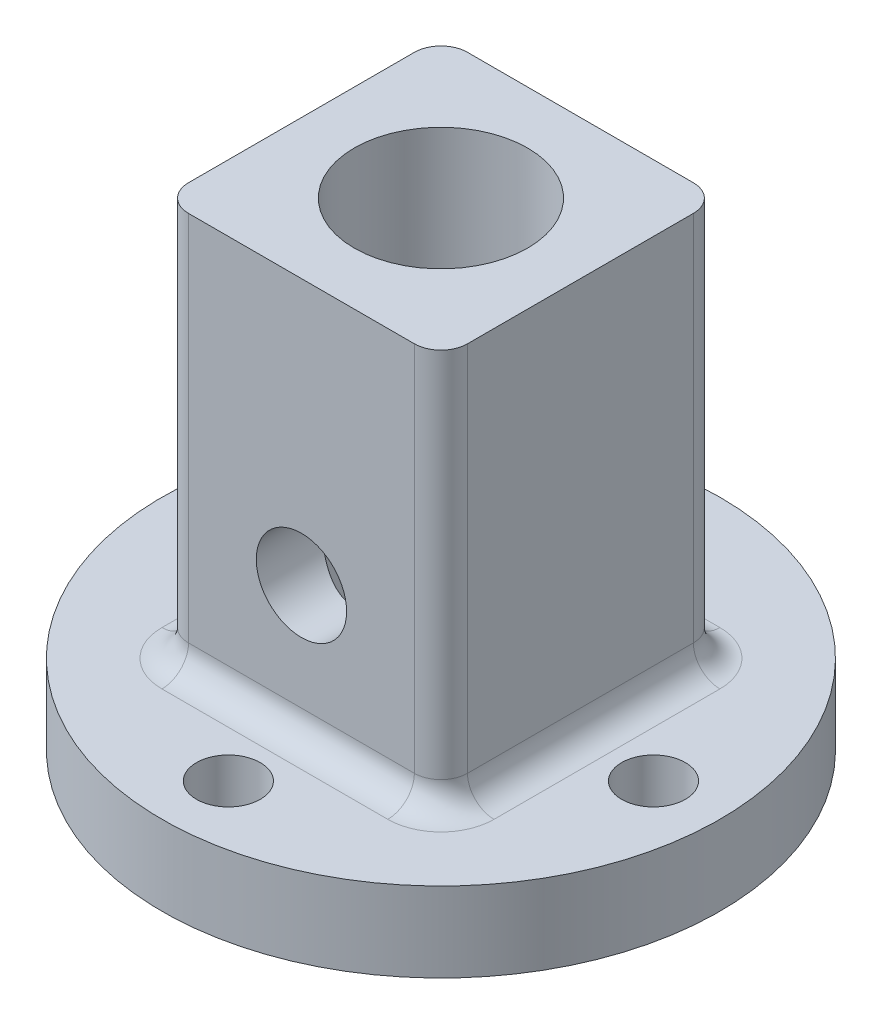
ISO-10303-21;
HEADER;
FILE_DESCRIPTION(('STEP AP214'),'2;1');
FILE_NAME('part.step','',(''),(''),'','','');
FILE_SCHEMA(('AUTOMOTIVE_DESIGN { 1 0 10303 214 1 1 1 1 }'));
ENDSEC;
DATA;
#1=APPLICATION_CONTEXT('core data for automotive mechanical design processes');
#2=APPLICATION_PROTOCOL_DEFINITION('international standard','automotive_design',2000,#1);
#3=PRODUCT_CONTEXT('',#1,'mechanical');
#4=PRODUCT('Part','Part','',(#3));
#5=PRODUCT_RELATED_PRODUCT_CATEGORY('part','',(#4));
#6=PRODUCT_DEFINITION_FORMATION('','',#4);
#7=PRODUCT_DEFINITION_CONTEXT('part definition',#1,'design');
#8=PRODUCT_DEFINITION('design','',#6,#7);
#9=PRODUCT_DEFINITION_SHAPE('','',#8);
#10=(LENGTH_UNIT() NAMED_UNIT(*) SI_UNIT(.MILLI.,.METRE.));
#11=(NAMED_UNIT(*) PLANE_ANGLE_UNIT() SI_UNIT($,.RADIAN.));
#12=(NAMED_UNIT(*) SI_UNIT($,.STERADIAN.) SOLID_ANGLE_UNIT());
#13=UNCERTAINTY_MEASURE_WITH_UNIT(LENGTH_MEASURE(1.E-05),#10,'distance_accuracy_value','');
#14=(GEOMETRIC_REPRESENTATION_CONTEXT(3) GLOBAL_UNCERTAINTY_ASSIGNED_CONTEXT((#13)) GLOBAL_UNIT_ASSIGNED_CONTEXT((#10,
#11,#12)) REPRESENTATION_CONTEXT('',''));
#15=CARTESIAN_POINT('',(0.,0.,0.));
#16=DIRECTION('',(0.,0.,1.));
#17=DIRECTION('',(1.,0.,0.));
#18=AXIS2_PLACEMENT_3D('',#15,#16,#17);
#19=CARTESIAN_POINT('',(0.,0.,0.));
#20=DIRECTION('',(0.,-1.,0.));
#21=DIRECTION('',(0.,0.,-1.));
#22=AXIS2_PLACEMENT_3D('',#19,#20,#21);
#23=CYLINDRICAL_SURFACE('',#22,3.2639);
#24=CARTESIAN_POINT('',(0.,9.7,-3.2639));
#25=CARTESIAN_POINT('',(0.0889192539065715,9.69999421936241,-3.26389489353846));
#26=CARTESIAN_POINT('',(0.177930825723036,9.69298277566448,-3.2602281248447));
#27=CARTESIAN_POINT('',(0.353294599999136,9.66526075740567,-3.24592069687696));
#28=CARTESIAN_POINT('',(0.439642069625119,9.64452712400293,-3.23526829919022));
#29=CARTESIAN_POINT('',(0.606879235943825,9.59040614816557,-3.20809775376268));
#30=CARTESIAN_POINT('',(0.687789210697539,9.55706929150517,-3.19160302555406));
#31=CARTESIAN_POINT('',(0.842731615956464,9.47896529307347,-3.15423646494357));
#32=CARTESIAN_POINT('',(0.916764223626788,9.43419844585704,-3.13336474534077));
#33=CARTESIAN_POINT('',(1.06118067231626,9.33126071672762,-3.0875619468176));
#34=CARTESIAN_POINT('',(1.13102742335631,9.27241514792155,-3.06245652444679));
#35=CARTESIAN_POINT('',(1.26036167015877,9.14445435991444,-3.01153977613525));
#36=CARTESIAN_POINT('',(1.31984054511494,9.07533068219815,-2.98572788320637));
#37=CARTESIAN_POINT('',(1.43189275170146,8.92167324767799,-2.93374528304452));
#38=CARTESIAN_POINT('',(1.48343334469224,8.83632567756727,-2.90773437399813));
#39=CARTESIAN_POINT('',(1.57121539482756,8.65669847053769,-2.86125981137321));
#40=CARTESIAN_POINT('',(1.60746838580021,8.56242563333723,-2.8407919799711));
#41=CARTESIAN_POINT('',(1.66118245029071,8.37350274719886,-2.80970327585631));
#42=CARTESIAN_POINT('',(1.67966523670616,8.27923507897954,-2.79855263023197));
#43=CARTESIAN_POINT('',(1.70040768515966,8.08833409528625,-2.7860046343306));
#44=CARTESIAN_POINT('',(1.7026860184695,7.99170363122019,-2.78459605899068));
#45=CARTESIAN_POINT('',(1.69170150006733,7.81261909548971,-2.79127279580565));
#46=CARTESIAN_POINT('',(1.68045805135594,7.72998326963533,-2.79812477811924));
#47=CARTESIAN_POINT('',(1.64627804634659,7.56800039292386,-2.81836877123419));
#48=CARTESIAN_POINT('',(1.62333718973305,7.48865456317559,-2.83176318715279));
#49=CARTESIAN_POINT('',(1.56603279985881,7.33324404067888,-2.86385723999079));
#50=CARTESIAN_POINT('',(1.53141952890862,7.25729622162773,-2.88267142771195));
#51=CARTESIAN_POINT('',(1.45195235504041,7.11190881630482,-2.92350330622128));
#52=CARTESIAN_POINT('',(1.40709386585157,7.04247216445217,-2.9455224300928));
#53=CARTESIAN_POINT('',(1.30114363985103,6.90190620953207,-2.99397908098991));
#54=CARTESIAN_POINT('',(1.23866159997768,6.83188599369344,-3.02060506534266));
#55=CARTESIAN_POINT('',(1.10278838646652,6.70283269067021,-3.07281637173659));
#56=CARTESIAN_POINT('',(1.02939116358114,6.64380573712369,-3.09840110663389));
#57=CARTESIAN_POINT('',(0.868754395914913,6.53536658358587,-3.147336227194));
#58=CARTESIAN_POINT('',(0.780979301047911,6.48665138742083,-3.17048957533389));
#59=CARTESIAN_POINT('',(0.596973225636251,6.40509397833558,-3.21021726040053));
#60=CARTESIAN_POINT('',(0.500749566789388,6.3722381787155,-3.22679722654143));
#61=CARTESIAN_POINT('',(0.311577061630775,6.32621611721861,-3.2502679328765));
#62=CARTESIAN_POINT('',(0.219075916667877,6.31158111053606,-3.25787830434908));
#63=CARTESIAN_POINT('',(0.0326338636985354,6.29774901467642,-3.26506696945457));
#64=CARTESIAN_POINT('',(-0.0613062445989497,6.29854364074288,-3.26464957350217));
#65=CARTESIAN_POINT('',(-0.239384596130518,6.31476965754066,-3.25622597838057));
#66=CARTESIAN_POINT('',(-0.323673359803918,6.3289418808946,-3.24887266619871));
#67=CARTESIAN_POINT('',(-0.488485875417265,6.36948313477095,-3.22820771138276));
#68=CARTESIAN_POINT('',(-0.569009226240815,6.39585346147078,-3.21489543555067));
#69=CARTESIAN_POINT('',(-0.726505387405166,6.4606378166898,-3.1830588827043));
#70=CARTESIAN_POINT('',(-0.803327548765636,6.49935250126827,-3.16440582921028));
#71=CARTESIAN_POINT('',(-0.94962040097271,6.5873721097804,-3.12362616284336));
#72=CARTESIAN_POINT('',(-1.01908808991205,6.63668133344569,-3.10149814065891));
#73=CARTESIAN_POINT('',(-1.1563961335245,6.75039952487059,-3.05313368132713));
#74=CARTESIAN_POINT('',(-1.22331167565208,6.81584680018033,-3.02670943641372));
#75=CARTESIAN_POINT('',(-1.34566531864602,6.95696725873411,-2.97433464580727));
#76=CARTESIAN_POINT('',(-1.40109380416567,7.03264892191007,-2.94838451340779));
#77=CARTESIAN_POINT('',(-1.50209002789184,7.19773116143163,-2.89829895766054));
#78=CARTESIAN_POINT('',(-1.54686768173241,7.28768210841116,-2.87436550813327));
#79=CARTESIAN_POINT('',(-1.62018008746824,7.47546361089356,-2.83369731646727));
#80=CARTESIAN_POINT('',(-1.64873728689744,7.57328306192848,-2.81695263365279));
#81=CARTESIAN_POINT('',(-1.6860352750084,7.76385057032795,-2.79477334320924));
#82=CARTESIAN_POINT('',(-1.69644051721857,7.85615942358405,-2.78839302248311));
#83=CARTESIAN_POINT('',(-1.70201551021434,8.04138744329674,-2.78499638259617));
#84=CARTESIAN_POINT('',(-1.69719401302091,8.13430622853641,-2.78797468428408));
#85=CARTESIAN_POINT('',(-1.67403886627255,8.30715722656502,-2.80192417100125));
#86=CARTESIAN_POINT('',(-1.65726826163683,8.38738410425869,-2.81196920092185));
#87=CARTESIAN_POINT('',(-1.61274221338893,8.54376115595358,-2.83773913939417));
#88=CARTESIAN_POINT('',(-1.58498294306665,8.61990989928003,-2.85346602643789));
#89=CARTESIAN_POINT('',(-1.51724690914756,8.77156364234236,-2.89008234591808));
#90=CARTESIAN_POINT('',(-1.47658497742521,8.84669478489698,-2.91124390365565));
#91=CARTESIAN_POINT('',(-1.38490700740978,8.98956871161725,-2.95595614918204));
#92=CARTESIAN_POINT('',(-1.33388541400171,9.0573075017259,-2.97950811536575));
#93=CARTESIAN_POINT('',(-1.21483715136891,9.19305787586591,-3.03017175429263));
#94=CARTESIAN_POINT('',(-1.14544221149176,9.25985784791518,-3.05733258547412));
#95=CARTESIAN_POINT('',(-0.99578021395563,9.38119620726782,-3.10929853545103));
#96=CARTESIAN_POINT('',(-0.915506662971243,9.43572721924976,-3.13410223213978));
#97=CARTESIAN_POINT('',(-0.744291971501571,9.53160680866663,-3.1791571090096));
#98=CARTESIAN_POINT('',(-0.653191033970638,9.57271239646635,-3.1993226051511));
#99=CARTESIAN_POINT('',(-0.464098723529768,9.63846556011756,-3.23214975856737));
#100=CARTESIAN_POINT('',(-0.366127055736499,9.66315823278371,-3.24483196636984));
#101=CARTESIAN_POINT('',(-0.222540580468572,9.68596287255582,-3.25660671209736));
#102=CARTESIAN_POINT('',(-0.178248981723963,9.69121788232584,-3.25933316755969));
#103=CARTESIAN_POINT('',(-0.0893126926581972,9.69823793688458,-3.26298111423025));
#104=CARTESIAN_POINT('',(-0.0446679944871644,9.70000290386476,-3.26390256519692));
#105=CARTESIAN_POINT('',(0.,9.7,-3.2639));
#106=B_SPLINE_CURVE_WITH_KNOTS('',3,(#24,#25,#26,#27,#28,#29,#30,#31,#32,#33,#34,#35,#36,#37,
#38,#39,#40,#41,#42,#43,#44,#45,#46,#47,#48,#49,#50,#51,#52,#53,#54,#55,#56,#57,#58,#59,#60,#61,
#62,#63,#64,#65,#66,#67,#68,#69,#70,#71,#72,#73,#74,#75,#76,#77,#78,#79,#80,#81,#82,#83,#84,#85,
#86,#87,#88,#89,#90,#91,#92,#93,#94,#95,#96,#97,#98,#99,#100,#101,#102,#103,#104,#105),
.UNSPECIFIED.,.T.,.F.,(4,2,2,2,2,2,2,2,2,2,2,2,2,2,2,2,2,2,2,2,2,2,2,2,2,2,2,2,2,2,2,2,2,2,2,2,
2,2,2,2,4),(0.,0.266577180236003,0.533603459462388,0.799571232396236,1.0655321519392,
1.34852128382934,1.63174460798852,1.93930788163416,2.24663869526074,2.53500155793278,
2.82303210609351,3.07289484702665,3.32284951124572,3.57853268756737,3.83433054555511,
4.1257246633607,4.41728087921789,4.72468464715455,5.03182459368712,5.31214568124739,
5.59231625792225,5.8484959300364,6.10470283020407,6.36769961086777,6.63080332952852,
6.92133861162609,7.21211611534265,7.52032084084585,7.82809799517227,8.1057841978355,
8.38331082115685,8.62995985981013,8.8766948675789,9.13970668311305,9.40285990653244,
9.70174125004616,10.0008017848752,10.3050085302817,10.6083759306922,10.742286214828,
10.8761994843848),.UNSPECIFIED.);
#107=CARTESIAN_POINT('',(0.,9.7,-3.2639));
#108=VERTEX_POINT('',#107);
#109=EDGE_CURVE('E279',#108,#108,#106,.T.);
#110=ORIENTED_EDGE('',*,*,#109,.T.);
#111=EDGE_LOOP('',(#110));
#112=FACE_BOUND('',#111,.T.);
#113=CARTESIAN_POINT('',(0.,18.,0.));
#114=DIRECTION('',(0.,1.,0.));
#115=DIRECTION('',(0.,0.,1.));
#116=AXIS2_PLACEMENT_3D('',#113,#114,#115);
#117=CIRCLE('',#116,3.2639);
#118=CARTESIAN_POINT('',(0.,18.,3.2639));
#119=VERTEX_POINT('',#118);
#120=EDGE_CURVE('E350',#119,#119,#117,.T.);
#121=ORIENTED_EDGE('',*,*,#120,.T.);
#122=EDGE_LOOP('',(#121));
#123=FACE_BOUND('',#122,.T.);
#124=CARTESIAN_POINT('',(1.7,8.,2.78622382625661));
#125=CARTESIAN_POINT('',(1.69999344038781,8.08799494842375,2.78623240253586));
#126=CARTESIAN_POINT('',(1.69312143794502,8.17608756816093,2.79045690115754));
#127=CARTESIAN_POINT('',(1.66600576176129,8.34952119183444,2.80672428500911));
#128=CARTESIAN_POINT('',(1.6457363555298,8.43485656842164,2.8187822152032));
#129=CARTESIAN_POINT('',(1.59296875631966,8.59993297885639,2.8489300371601));
#130=CARTESIAN_POINT('',(1.56053999644946,8.67970278262016,2.86698561521914));
#131=CARTESIAN_POINT('',(1.48458709835157,8.83264670697399,2.90704017405679));
#132=CARTESIAN_POINT('',(1.44106158949795,8.90582001127853,2.92903964186913));
#133=CARTESIAN_POINT('',(1.33956634167169,9.05074997248104,2.97691527784031));
#134=CARTESIAN_POINT('',(1.28064958754223,9.12178732923653,3.00296215840256));
#135=CARTESIAN_POINT('',(1.15200811047273,9.25353928597895,3.05462394241327));
#136=CARTESIAN_POINT('',(1.08227762481149,9.31424834555071,3.08023860741334));
#137=CARTESIAN_POINT('',(0.927632427210276,9.42806969199548,3.13043504172595));
#138=CARTESIAN_POINT('',(0.841972599022174,9.48027588850413,3.15479676549832));
#139=CARTESIAN_POINT('',(0.661578145721231,9.56920524511248,3.19748692078768));
#140=CARTESIAN_POINT('',(0.566849781750523,9.60593899449657,3.21581947675467));
#141=CARTESIAN_POINT('',(0.378645790415,9.65996030248609,3.24314850589571));
#142=CARTESIAN_POINT('',(0.285623817203519,9.67851539953416,3.25274948391051));
#143=CARTESIAN_POINT('',(0.0973320350246927,9.69984882523399,3.26380771169167));
#144=CARTESIAN_POINT('',(0.00206376402366661,9.70263765064047,3.26527037971316));
#145=CARTESIAN_POINT('',(-0.178394767196052,9.69279820364356,3.26015342155181));
#146=CARTESIAN_POINT('',(-0.263689204620032,9.68159708695309,3.25431819800173));
#147=CARTESIAN_POINT('',(-0.430983282678775,9.64668026562209,3.23641388521436));
#148=CARTESIAN_POINT('',(-0.512982674121925,9.62296361638978,3.22434432545099));
#149=CARTESIAN_POINT('',(-0.672708482901269,9.56359217104932,3.19486984560071));
#150=CARTESIAN_POINT('',(-0.750366923514348,9.52778872300434,3.17739873041939));
#151=CARTESIAN_POINT('',(-0.898748482890959,9.4454953840801,3.13865947249717));
#152=CARTESIAN_POINT('',(-0.969469193661431,9.39900180138933,3.11739001857738));
#153=CARTESIAN_POINT('',(-1.10954024502924,9.29131248534345,3.07049669828946));
#154=CARTESIAN_POINT('',(-1.17804251383268,9.229110143958,3.044650061735));
#155=CARTESIAN_POINT('',(-1.30412061175683,9.09443590324617,2.9928195310303));
#156=CARTESIAN_POINT('',(-1.36168679840994,9.02195503865126,2.96683553632387));
#157=CARTESIAN_POINT('',(-1.46841770212131,8.86233627198733,2.91557034660113));
#158=CARTESIAN_POINT('',(-1.51666006446438,8.77451410615725,2.89047953413353));
#159=CARTESIAN_POINT('',(-1.59733272363585,8.59042141266093,2.84669936406955));
#160=CARTESIAN_POINT('',(-1.62978051066344,8.49416036991663,2.82800293248143));
#161=CARTESIAN_POINT('',(-1.675206845578,8.30404211530226,2.801316248722));
#162=CARTESIAN_POINT('',(-1.6895465386882,8.21061900798832,2.79258306941674));
#163=CARTESIAN_POINT('',(-1.70246462307576,8.02231941663952,2.78473107779519));
#164=CARTESIAN_POINT('',(-1.70105655912752,7.9274442516721,2.78560400317948));
#165=CARTESIAN_POINT('',(-1.68376815294627,7.75147639752432,2.79607515029883));
#166=CARTESIAN_POINT('',(-1.66969761893157,7.67012928772645,2.80458187711804));
#167=CARTESIAN_POINT('',(-1.63025242782306,7.51113406899061,2.82769142328687));
#168=CARTESIAN_POINT('',(-1.60487366680774,7.43348731430057,2.84229645567991));
#169=CARTESIAN_POINT('',(-1.54235419556308,7.28005601401792,2.87671844307668));
#170=CARTESIAN_POINT('',(-1.50473211271891,7.20451576289591,2.89674178860644));
#171=CARTESIAN_POINT('',(-1.41920235462073,7.06037408547281,2.93959097008831));
#172=CARTESIAN_POINT('',(-1.37128939302664,6.99177625218009,2.96241824380549));
#173=CARTESIAN_POINT('',(-1.25876837027179,6.8534778694645,3.01211363429316));
#174=CARTESIAN_POINT('',(-1.19276525084153,6.78495030440069,3.03910226915311));
#175=CARTESIAN_POINT('',(-1.04985323917641,6.65953364013761,3.09138181901318));
#176=CARTESIAN_POINT('',(-0.972939644664397,6.60264958510386,3.11667199503793));
#177=CARTESIAN_POINT('',(-0.806772404834094,6.50034576682651,3.16383802555148));
#178=CARTESIAN_POINT('',(-0.717177986657926,6.45540384407461,3.18556107859074));
#179=CARTESIAN_POINT('',(-0.53024382492367,6.38169576731736,3.22194325033254));
#180=CARTESIAN_POINT('',(-0.432911530095294,6.35291426694748,3.23660906887235));
#181=CARTESIAN_POINT('',(-0.243382984842846,6.31501123279113,3.25607063601355));
#182=CARTESIAN_POINT('',(-0.151595700916335,6.30426238259727,3.26168135137468));
#183=CARTESIAN_POINT('',(0.0326351089793591,6.29781937444168,3.26503460911253));
#184=CARTESIAN_POINT('',(0.12507834649627,6.30211896439425,3.26278041907582));
#185=CARTESIAN_POINT('',(0.300641821054113,6.32463209733551,3.25112621350634));
#186=CARTESIAN_POINT('',(0.383940250376373,6.3417745927391,3.2422765192425));
#187=CARTESIAN_POINT('',(0.546314501413933,6.3879614886044,3.21889976205914));
#188=CARTESIAN_POINT('',(0.625389761899115,6.41700746653052,3.2043719466797));
#189=CARTESIAN_POINT('',(0.780648063965894,6.48733928162585,3.1702057266056));
#190=CARTESIAN_POINT('',(0.856589725307146,6.52906734698236,3.15038649828397));
#191=CARTESIAN_POINT('',(1.00068579895886,6.62303384266714,3.10762440588818));
#192=CARTESIAN_POINT('',(1.0688367182943,6.67527695865889,3.0846801507343));
#193=CARTESIAN_POINT('',(1.20309029047405,6.79521111174183,3.0350071266797));
#194=CARTESIAN_POINT('',(1.26820191505845,6.86395477267661,3.00813554009433));
#195=CARTESIAN_POINT('',(1.38638624169896,7.01162490018856,2.95553233938238));
#196=CARTESIAN_POINT('',(1.43944667377203,7.09056161779149,2.92980190838217));
#197=CARTESIAN_POINT('',(1.53417982617242,7.260934813837,2.88137044564241));
#198=CARTESIAN_POINT('',(1.57523054476244,7.35277463647638,2.85885853802456));
#199=CARTESIAN_POINT('',(1.64066028503697,7.54357388083543,2.82182969279832));
#200=CARTESIAN_POINT('',(1.66509448748366,7.64250851967399,2.80728632453728));
#201=CARTESIAN_POINT('',(1.68696785915576,7.78554752396708,2.79414155004155));
#202=CARTESIAN_POINT('',(1.6918457373378,7.8282285106123,2.79118532871714));
#203=CARTESIAN_POINT('',(1.69836350778613,7.91393186054064,2.78722431152098));
#204=CARTESIAN_POINT('',(1.70000320885996,7.95695424383034,2.78621963087457));
#205=CARTESIAN_POINT('',(1.7,8.,2.78622382625661));
#206=B_SPLINE_CURVE_WITH_KNOTS('',3,(#124,#125,#126,#127,#128,#129,#130,#131,#132,#133,#134,
#135,#136,#137,#138,#139,#140,#141,#142,#143,#144,#145,#146,#147,#148,#149,#150,#151,#152,#153,
#154,#155,#156,#157,#158,#159,#160,#161,#162,#163,#164,#165,#166,#167,#168,#169,#170,#171,#172,
#173,#174,#175,#176,#177,#178,#179,#180,#181,#182,#183,#184,#185,#186,#187,#188,#189,#190,#191,
#192,#193,#194,#195,#196,#197,#198,#199,#200,#201,#202,#203,#204,#205),.UNSPECIFIED.,.T.,.F.,(4,
2,2,2,2,2,2,2,2,2,2,2,2,2,2,2,2,2,2,2,2,2,2,2,2,2,2,2,2,2,2,2,2,2,2,2,2,2,2,2,4),(0.,
0.263803238035845,0.528114643008637,0.790939193498229,1.05379622276293,1.34029412856177,
1.62694523931762,1.93500659826193,2.24285677724342,2.52727030977008,2.81149446518516,
3.06895210801352,3.32642918486626,3.58719581953326,3.84805264493379,4.13505943805143,
4.42231812560688,4.73058560277369,5.03851093747169,5.32155870557313,5.60436304071492,
5.85222184916728,6.10017068257508,6.35936826141884,6.6186993077482,6.91409011414732,
7.20960861925666,7.51560220682561,7.82130472120071,8.09754702406812,8.37367457181939,
8.62902966727341,8.88441861365282,9.15000013478269,9.41570026607059,9.70969590720726,
10.003989552869,10.3115647658588,10.6181135172175,10.7471543275401,10.8762027566223),.UNSPECIFIED.);
#207=CARTESIAN_POINT('',(1.7,8.,2.78622382625661));
#208=VERTEX_POINT('',#207);
#209=EDGE_CURVE('E271',#208,#208,#206,.T.);
#210=ORIENTED_EDGE('',*,*,#209,.T.);
#211=EDGE_LOOP('',(#210));
#212=FACE_BOUND('',#211,.T.);
#213=CARTESIAN_POINT('',(0.,3.,0.));
#214=DIRECTION('',(0.,-1.,0.));
#215=DIRECTION('',(0.,0.,-1.));
#216=AXIS2_PLACEMENT_3D('',#213,#214,#215);
#217=CIRCLE('',#216,3.2639);
#218=CARTESIAN_POINT('',(0.,3.,-3.2639));
#219=VERTEX_POINT('',#218);
#220=EDGE_CURVE('E213',#219,#219,#217,.T.);
#221=ORIENTED_EDGE('',*,*,#220,.T.);
#222=EDGE_LOOP('',(#221));
#223=FACE_BOUND('',#222,.T.);
#224=ADVANCED_FACE('F40',(#112,#123,#212,#223),#23,.F.);
#225=CARTESIAN_POINT('',(3.2639,3.,0.));
#226=DIRECTION('',(0.,1.,0.));
#227=DIRECTION('',(0.,0.,1.));
#228=AXIS2_PLACEMENT_3D('',#225,#226,#227);
#229=PLANE('',#228);
#230=DIRECTION('',(1.,0.,0.));
#231=VECTOR('',#230,1.);
#232=CARTESIAN_POINT('',(3.2639,3.,6.25));
#233=LINE('',#232,#231);
#234=CARTESIAN_POINT('',(4.25,3.,6.25));
#235=VERTEX_POINT('',#234);
#236=CARTESIAN_POINT('',(-4.25,3.,6.25));
#237=VERTEX_POINT('',#236);
#238=EDGE_CURVE('E179',#235,#237,#233,.F.);
#239=ORIENTED_EDGE('',*,*,#238,.T.);
#240=CARTESIAN_POINT('',(-4.25,3.,4.25));
#241=DIRECTION('',(0.,1.,0.));
#242=DIRECTION('',(0.,0.,1.));
#243=AXIS2_PLACEMENT_3D('',#240,#241,#242);
#244=CIRCLE('',#243,2.);
#245=CARTESIAN_POINT('',(-6.25,3.,4.25));
#246=VERTEX_POINT('',#245);
#247=EDGE_CURVE('E193',#237,#246,#244,.F.);
#248=ORIENTED_EDGE('',*,*,#247,.T.);
#249=DIRECTION('',(0.,0.,1.));
#250=VECTOR('',#249,1.);
#251=CARTESIAN_POINT('',(-6.25,3.,0.));
#252=LINE('',#251,#250);
#253=CARTESIAN_POINT('',(-6.25,3.,-4.25));
#254=VERTEX_POINT('',#253);
#255=EDGE_CURVE('E191',#246,#254,#252,.F.);
#256=ORIENTED_EDGE('',*,*,#255,.T.);
#257=CARTESIAN_POINT('',(-4.25,3.,-4.25));
#258=DIRECTION('',(0.,1.,0.));
#259=DIRECTION('',(0.,0.,1.));
#260=AXIS2_PLACEMENT_3D('',#257,#258,#259);
#261=CIRCLE('',#260,2.);
#262=CARTESIAN_POINT('',(-4.25,3.,-6.25));
#263=VERTEX_POINT('',#262);
#264=EDGE_CURVE('E189',#254,#263,#261,.F.);
#265=ORIENTED_EDGE('',*,*,#264,.T.);
#266=DIRECTION('',(-1.,0.,0.));
#267=VECTOR('',#266,1.);
#268=CARTESIAN_POINT('',(3.2639,3.,-6.25));
#269=LINE('',#268,#267);
#270=CARTESIAN_POINT('',(4.25,3.,-6.25));
#271=VERTEX_POINT('',#270);
#272=EDGE_CURVE('E187',#263,#271,#269,.F.);
#273=ORIENTED_EDGE('',*,*,#272,.T.);
#274=CARTESIAN_POINT('',(4.25,3.,-4.25));
#275=DIRECTION('',(0.,1.,0.));
#276=DIRECTION('',(0.,0.,1.));
#277=AXIS2_PLACEMENT_3D('',#274,#275,#276);
#278=CIRCLE('',#277,2.);
#279=CARTESIAN_POINT('',(6.25,3.,-4.25));
#280=VERTEX_POINT('',#279);
#281=EDGE_CURVE('E185',#271,#280,#278,.F.);
#282=ORIENTED_EDGE('',*,*,#281,.T.);
#283=DIRECTION('',(0.,0.,-1.));
#284=VECTOR('',#283,1.);
#285=CARTESIAN_POINT('',(6.25,3.,0.));
#286=LINE('',#285,#284);
#287=CARTESIAN_POINT('',(6.25,3.,4.25));
#288=VERTEX_POINT('',#287);
#289=EDGE_CURVE('E183',#280,#288,#286,.F.);
#290=ORIENTED_EDGE('',*,*,#289,.T.);
#291=CARTESIAN_POINT('',(4.25,3.,4.25));
#292=DIRECTION('',(0.,1.,0.));
#293=DIRECTION('',(0.,0.,1.));
#294=AXIS2_PLACEMENT_3D('',#291,#292,#293);
#295=CIRCLE('',#294,2.);
#296=EDGE_CURVE('E181',#288,#235,#295,.F.);
#297=ORIENTED_EDGE('',*,*,#296,.T.);
#298=EDGE_LOOP('',(#239,#248,#256,#265,#273,#282,#290,#297));
#299=FACE_BOUND('',#298,.T.);
#300=CARTESIAN_POINT('',(0.,3.,-8.));
#301=DIRECTION('',(0.,1.,0.));
#302=DIRECTION('',(0.,0.,1.));
#303=AXIS2_PLACEMENT_3D('',#300,#301,#302);
#304=CIRCLE('',#303,1.2);
#305=CARTESIAN_POINT('',(0.,3.,-6.8));
#306=VERTEX_POINT('',#305);
#307=EDGE_CURVE('E246',#306,#306,#304,.T.);
#308=ORIENTED_EDGE('',*,*,#307,.F.);
#309=EDGE_LOOP('',(#308));
#310=FACE_BOUND('',#309,.T.);
#311=CARTESIAN_POINT('',(8.00000000000071,3.,0.));
#312=DIRECTION('',(0.,1.,0.));
#313=DIRECTION('',(0.,0.,1.));
#314=AXIS2_PLACEMENT_3D('',#311,#312,#313);
#315=CIRCLE('',#314,1.2);
#316=CARTESIAN_POINT('',(8.00000000000071,3.,1.2));
#317=VERTEX_POINT('',#316);
#318=EDGE_CURVE('E252',#317,#317,#315,.T.);
#319=ORIENTED_EDGE('',*,*,#318,.F.);
#320=EDGE_LOOP('',(#319));
#321=FACE_BOUND('',#320,.T.);
#322=CARTESIAN_POINT('',(0.,3.,8.));
#323=DIRECTION('',(0.,1.,0.));
#324=DIRECTION('',(0.,0.,1.));
#325=AXIS2_PLACEMENT_3D('',#322,#323,#324);
#326=CIRCLE('',#325,1.2);
#327=CARTESIAN_POINT('',(0.,3.,9.2));
#328=VERTEX_POINT('',#327);
#329=EDGE_CURVE('E258',#328,#328,#326,.T.);
#330=ORIENTED_EDGE('',*,*,#329,.F.);
#331=EDGE_LOOP('',(#330));
#332=FACE_BOUND('',#331,.T.);
#333=CARTESIAN_POINT('',(-7.99999999999929,3.,-1.41645175974107E-12));
#334=DIRECTION('',(0.,1.,0.));
#335=DIRECTION('',(0.,0.,1.));
#336=AXIS2_PLACEMENT_3D('',#333,#334,#335);
#337=CIRCLE('',#336,1.2);
#338=CARTESIAN_POINT('',(-7.99999999999929,3.,1.19999999999858));
#339=VERTEX_POINT('',#338);
#340=EDGE_CURVE('E232',#339,#339,#337,.T.);
#341=ORIENTED_EDGE('',*,*,#340,.F.);
#342=EDGE_LOOP('',(#341));
#343=FACE_BOUND('',#342,.T.);
#344=CARTESIAN_POINT('',(0.,3.,0.));
#345=DIRECTION('',(0.,-1.,0.));
#346=DIRECTION('',(0.,0.,-1.));
#347=AXIS2_PLACEMENT_3D('',#344,#345,#346);
#348=CIRCLE('',#347,10.5);
#349=CARTESIAN_POINT('',(0.,3.,-10.5));
#350=VERTEX_POINT('',#349);
#351=EDGE_CURVE('E161',#350,#350,#348,.T.);
#352=ORIENTED_EDGE('',*,*,#351,.F.);
#353=EDGE_LOOP('',(#352));
#354=FACE_BOUND('',#353,.T.);
#355=ADVANCED_FACE('F320',(#299,#310,#321,#332,#343,#354),#229,.T.);
#356=CARTESIAN_POINT('',(0.,0.,0.));
#357=DIRECTION('',(0.,-1.,0.));
#358=DIRECTION('',(0.,0.,-1.));
#359=AXIS2_PLACEMENT_3D('',#356,#357,#358);
#360=CYLINDRICAL_SURFACE('',#359,10.5);
#361=ORIENTED_EDGE('',*,*,#351,.T.);
#362=EDGE_LOOP('',(#361));
#363=FACE_BOUND('',#362,.T.);
#364=CARTESIAN_POINT('',(0.,0.,0.));
#365=DIRECTION('',(0.,-1.,0.));
#366=DIRECTION('',(0.,0.,-1.));
#367=AXIS2_PLACEMENT_3D('',#364,#365,#366);
#368=CIRCLE('',#367,10.5);
#369=CARTESIAN_POINT('',(0.,0.,-10.5));
#370=VERTEX_POINT('',#369);
#371=EDGE_CURVE('E341',#370,#370,#368,.T.);
#372=ORIENTED_EDGE('',*,*,#371,.F.);
#373=EDGE_LOOP('',(#372));
#374=FACE_BOUND('',#373,.T.);
#375=ADVANCED_FACE('F317',(#363,#374),#360,.T.);
#376=CARTESIAN_POINT('',(10.5,0.,0.));
#377=DIRECTION('',(0.,-1.,0.));
#378=DIRECTION('',(0.,0.,-1.));
#379=AXIS2_PLACEMENT_3D('',#376,#377,#378);
#380=PLANE('',#379);
#381=CARTESIAN_POINT('',(0.,0.,0.));
#382=DIRECTION('',(0.,-1.,0.));
#383=DIRECTION('',(0.,0.,-1.));
#384=AXIS2_PLACEMENT_3D('',#381,#382,#383);
#385=CIRCLE('',#384,4.25);
#386=CARTESIAN_POINT('',(0.,0.,-4.25));
#387=VERTEX_POINT('',#386);
#388=EDGE_CURVE('E234',#387,#387,#385,.T.);
#389=ORIENTED_EDGE('',*,*,#388,.F.);
#390=EDGE_LOOP('',(#389));
#391=FACE_BOUND('',#390,.T.);
#392=CARTESIAN_POINT('',(0.,0.,-8.));
#393=DIRECTION('',(0.,1.,0.));
#394=DIRECTION('',(0.,0.,1.));
#395=AXIS2_PLACEMENT_3D('',#392,#393,#394);
#396=CIRCLE('',#395,1.2);
#397=CARTESIAN_POINT('',(0.,0.,-6.8));
#398=VERTEX_POINT('',#397);
#399=EDGE_CURVE('E242',#398,#398,#396,.T.);
#400=ORIENTED_EDGE('',*,*,#399,.T.);
#401=EDGE_LOOP('',(#400));
#402=FACE_BOUND('',#401,.T.);
#403=CARTESIAN_POINT('',(8.00000000000071,0.,0.));
#404=DIRECTION('',(0.,1.,0.));
#405=DIRECTION('',(0.,0.,1.));
#406=AXIS2_PLACEMENT_3D('',#403,#404,#405);
#407=CIRCLE('',#406,1.2);
#408=CARTESIAN_POINT('',(8.00000000000071,0.,1.2));
#409=VERTEX_POINT('',#408);
#410=EDGE_CURVE('E249',#409,#409,#407,.T.);
#411=ORIENTED_EDGE('',*,*,#410,.T.);
#412=EDGE_LOOP('',(#411));
#413=FACE_BOUND('',#412,.T.);
#414=CARTESIAN_POINT('',(0.,0.,8.));
#415=DIRECTION('',(0.,1.,0.));
#416=DIRECTION('',(0.,0.,1.));
#417=AXIS2_PLACEMENT_3D('',#414,#415,#416);
#418=CIRCLE('',#417,1.2);
#419=CARTESIAN_POINT('',(0.,0.,9.2));
#420=VERTEX_POINT('',#419);
#421=EDGE_CURVE('E255',#420,#420,#418,.T.);
#422=ORIENTED_EDGE('',*,*,#421,.T.);
#423=EDGE_LOOP('',(#422));
#424=FACE_BOUND('',#423,.T.);
#425=CARTESIAN_POINT('',(-7.99999999999929,0.,-1.41645175974107E-12));
#426=DIRECTION('',(0.,1.,0.));
#427=DIRECTION('',(0.,0.,1.));
#428=AXIS2_PLACEMENT_3D('',#425,#426,#427);
#429=CIRCLE('',#428,1.2);
#430=CARTESIAN_POINT('',(-7.99999999999929,0.,1.19999999999858));
#431=VERTEX_POINT('',#430);
#432=EDGE_CURVE('E261',#431,#431,#429,.T.);
#433=ORIENTED_EDGE('',*,*,#432,.T.);
#434=EDGE_LOOP('',(#433));
#435=FACE_BOUND('',#434,.T.);
#436=ORIENTED_EDGE('',*,*,#371,.T.);
#437=EDGE_LOOP('',(#436));
#438=FACE_BOUND('',#437,.T.);
#439=ADVANCED_FACE('F300',(#391,#402,#413,#424,#435,#438),#380,.T.);
#440=CARTESIAN_POINT('',(0.,18.,0.));
#441=DIRECTION('',(0.,1.,0.));
#442=DIRECTION('',(0.,0.,1.));
#443=AXIS2_PLACEMENT_3D('',#440,#441,#442);
#444=PLANE('',#443);
#445=DIRECTION('',(0.,0.,-1.));
#446=VECTOR('',#445,1.);
#447=CARTESIAN_POINT('',(5.25,18.,-5.25));
#448=LINE('',#447,#446);
#449=CARTESIAN_POINT('',(5.25,18.,4.25));
#450=VERTEX_POINT('',#449);
#451=CARTESIAN_POINT('',(5.25,18.,-4.25));
#452=VERTEX_POINT('',#451);
#453=EDGE_CURVE('E138',#450,#452,#448,.T.);
#454=ORIENTED_EDGE('',*,*,#453,.T.);
#455=CARTESIAN_POINT('',(4.25,18.,-4.25));
#456=DIRECTION('',(0.,1.,0.));
#457=DIRECTION('',(0.,0.,1.));
#458=AXIS2_PLACEMENT_3D('',#455,#456,#457);
#459=CIRCLE('',#458,1.);
#460=CARTESIAN_POINT('',(4.25,18.,-5.25));
#461=VERTEX_POINT('',#460);
#462=EDGE_CURVE('E131',#452,#461,#459,.T.);
#463=ORIENTED_EDGE('',*,*,#462,.T.);
#464=DIRECTION('',(-1.,0.,0.));
#465=VECTOR('',#464,1.);
#466=CARTESIAN_POINT('',(-5.25,18.,-5.25));
#467=LINE('',#466,#465);
#468=CARTESIAN_POINT('',(-4.25,18.,-5.25));
#469=VERTEX_POINT('',#468);
#470=EDGE_CURVE('E135',#461,#469,#467,.T.);
#471=ORIENTED_EDGE('',*,*,#470,.T.);
#472=CARTESIAN_POINT('',(-4.25,18.,-4.25));
#473=DIRECTION('',(0.,1.,0.));
#474=DIRECTION('',(0.,0.,1.));
#475=AXIS2_PLACEMENT_3D('',#472,#473,#474);
#476=CIRCLE('',#475,1.);
#477=CARTESIAN_POINT('',(-5.25,18.,-4.25));
#478=VERTEX_POINT('',#477);
#479=EDGE_CURVE('E143',#469,#478,#476,.T.);
#480=ORIENTED_EDGE('',*,*,#479,.T.);
#481=DIRECTION('',(0.,0.,1.));
#482=VECTOR('',#481,1.);
#483=CARTESIAN_POINT('',(-5.25,18.,-5.25));
#484=LINE('',#483,#482);
#485=CARTESIAN_POINT('',(-5.25,18.,4.25));
#486=VERTEX_POINT('',#485);
#487=EDGE_CURVE('E152',#478,#486,#484,.T.);
#488=ORIENTED_EDGE('',*,*,#487,.T.);
#489=CARTESIAN_POINT('',(-4.25,18.,4.25));
#490=DIRECTION('',(0.,1.,0.));
#491=DIRECTION('',(0.,0.,1.));
#492=AXIS2_PLACEMENT_3D('',#489,#490,#491);
#493=CIRCLE('',#492,1.);
#494=CARTESIAN_POINT('',(-4.25,18.,5.25));
#495=VERTEX_POINT('',#494);
#496=EDGE_CURVE('E166',#486,#495,#493,.T.);
#497=ORIENTED_EDGE('',*,*,#496,.T.);
#498=DIRECTION('',(1.,0.,0.));
#499=VECTOR('',#498,1.);
#500=CARTESIAN_POINT('',(-5.25,18.,5.25));
#501=LINE('',#500,#499);
#502=CARTESIAN_POINT('',(4.25,18.,5.25));
#503=VERTEX_POINT('',#502);
#504=EDGE_CURVE('E343',#495,#503,#501,.T.);
#505=ORIENTED_EDGE('',*,*,#504,.T.);
#506=CARTESIAN_POINT('',(4.25,18.,4.25));
#507=DIRECTION('',(0.,1.,0.));
#508=DIRECTION('',(0.,0.,1.));
#509=AXIS2_PLACEMENT_3D('',#506,#507,#508);
#510=CIRCLE('',#509,1.);
#511=EDGE_CURVE('E168',#503,#450,#510,.T.);
#512=ORIENTED_EDGE('',*,*,#511,.T.);
#513=EDGE_LOOP('',(#454,#463,#471,#480,#488,#497,#505,#512));
#514=FACE_BOUND('',#513,.T.);
#515=ORIENTED_EDGE('',*,*,#120,.F.);
#516=EDGE_LOOP('',(#515));
#517=FACE_BOUND('',#516,.T.);
#518=ADVANCED_FACE('F133',(#514,#517),#444,.T.);
#519=CARTESIAN_POINT('',(5.25,18.,-5.25));
#520=DIRECTION('',(-1.,0.,0.));
#521=DIRECTION('',(0.,0.,1.));
#522=AXIS2_PLACEMENT_3D('',#519,#520,#521);
#523=PLANE('',#522);
#524=DIRECTION('',(0.,-1.,0.));
#525=VECTOR('',#524,1.);
#526=CARTESIAN_POINT('',(5.25,18.,4.25));
#527=LINE('',#526,#525);
#528=CARTESIAN_POINT('',(5.25,4.,4.25));
#529=VERTEX_POINT('',#528);
#530=EDGE_CURVE('E157',#450,#529,#527,.T.);
#531=ORIENTED_EDGE('',*,*,#530,.T.);
#532=DIRECTION('',(0.,0.,-1.));
#533=VECTOR('',#532,1.);
#534=CARTESIAN_POINT('',(5.25,4.,-5.25));
#535=LINE('',#534,#533);
#536=CARTESIAN_POINT('',(5.25,4.,-4.25));
#537=VERTEX_POINT('',#536);
#538=EDGE_CURVE('E206',#529,#537,#535,.T.);
#539=ORIENTED_EDGE('',*,*,#538,.T.);
#540=DIRECTION('',(0.,-1.,0.));
#541=VECTOR('',#540,1.);
#542=CARTESIAN_POINT('',(5.25,18.,-4.25));
#543=LINE('',#542,#541);
#544=EDGE_CURVE('E159',#537,#452,#543,.F.);
#545=ORIENTED_EDGE('',*,*,#544,.T.);
#546=ORIENTED_EDGE('',*,*,#453,.F.);
#547=EDGE_LOOP('',(#531,#539,#545,#546));
#548=FACE_BOUND('',#547,.T.);
#549=ADVANCED_FACE('F299',(#548),#523,.F.);
#550=CARTESIAN_POINT('',(-5.25,18.,-5.25));
#551=DIRECTION('',(0.,0.,1.));
#552=DIRECTION('',(1.,0.,0.));
#553=AXIS2_PLACEMENT_3D('',#550,#551,#552);
#554=PLANE('',#553);
#555=CARTESIAN_POINT('',(0.,8.,-5.25));
#556=DIRECTION('',(0.,0.,1.));
#557=DIRECTION('',(1.,0.,0.));
#558=AXIS2_PLACEMENT_3D('',#555,#556,#557);
#559=CIRCLE('',#558,1.7);
#560=CARTESIAN_POINT('',(1.7,8.,-5.25));
#561=VERTEX_POINT('',#560);
#562=EDGE_CURVE('E268',#561,#561,#559,.F.);
#563=ORIENTED_EDGE('',*,*,#562,.F.);
#564=EDGE_LOOP('',(#563));
#565=FACE_BOUND('',#564,.T.);
#566=DIRECTION('',(0.,-1.,0.));
#567=VECTOR('',#566,1.);
#568=CARTESIAN_POINT('',(4.25,18.,-5.25));
#569=LINE('',#568,#567);
#570=CARTESIAN_POINT('',(4.25,4.,-5.25));
#571=VERTEX_POINT('',#570);
#572=EDGE_CURVE('E148',#461,#571,#569,.T.);
#573=ORIENTED_EDGE('',*,*,#572,.T.);
#574=DIRECTION('',(-1.,0.,0.));
#575=VECTOR('',#574,1.);
#576=CARTESIAN_POINT('',(-5.25,4.,-5.25));
#577=LINE('',#576,#575);
#578=CARTESIAN_POINT('',(-4.25,4.,-5.25));
#579=VERTEX_POINT('',#578);
#580=EDGE_CURVE('E203',#571,#579,#577,.T.);
#581=ORIENTED_EDGE('',*,*,#580,.T.);
#582=DIRECTION('',(0.,-1.,0.));
#583=VECTOR('',#582,1.);
#584=CARTESIAN_POINT('',(-4.25,18.,-5.25));
#585=LINE('',#584,#583);
#586=EDGE_CURVE('E151',#579,#469,#585,.F.);
#587=ORIENTED_EDGE('',*,*,#586,.T.);
#588=ORIENTED_EDGE('',*,*,#470,.F.);
#589=EDGE_LOOP('',(#573,#581,#587,#588));
#590=FACE_BOUND('',#589,.T.);
#591=ADVANCED_FACE('F147',(#565,#590),#554,.F.);
#592=CARTESIAN_POINT('',(-5.25,18.,-5.25));
#593=DIRECTION('',(1.,0.,0.));
#594=DIRECTION('',(0.,0.,-1.));
#595=AXIS2_PLACEMENT_3D('',#592,#593,#594);
#596=PLANE('',#595);
#597=DIRECTION('',(0.,-1.,0.));
#598=VECTOR('',#597,1.);
#599=CARTESIAN_POINT('',(-5.25,18.,-4.25));
#600=LINE('',#599,#598);
#601=CARTESIAN_POINT('',(-5.25,4.,-4.25));
#602=VERTEX_POINT('',#601);
#603=EDGE_CURVE('E172',#478,#602,#600,.T.);
#604=ORIENTED_EDGE('',*,*,#603,.T.);
#605=DIRECTION('',(0.,0.,1.));
#606=VECTOR('',#605,1.);
#607=CARTESIAN_POINT('',(-5.25,4.,-5.25));
#608=LINE('',#607,#606);
#609=CARTESIAN_POINT('',(-5.25,4.,4.25));
#610=VERTEX_POINT('',#609);
#611=EDGE_CURVE('E199',#602,#610,#608,.T.);
#612=ORIENTED_EDGE('',*,*,#611,.T.);
#613=DIRECTION('',(0.,-1.,0.));
#614=VECTOR('',#613,1.);
#615=CARTESIAN_POINT('',(-5.25,18.,4.25));
#616=LINE('',#615,#614);
#617=EDGE_CURVE('E142',#610,#486,#616,.F.);
#618=ORIENTED_EDGE('',*,*,#617,.T.);
#619=ORIENTED_EDGE('',*,*,#487,.F.);
#620=EDGE_LOOP('',(#604,#612,#618,#619));
#621=FACE_BOUND('',#620,.T.);
#622=ADVANCED_FACE('F304',(#621),#596,.F.);
#623=CARTESIAN_POINT('',(-5.25,18.,5.25));
#624=DIRECTION('',(0.,0.,-1.));
#625=DIRECTION('',(-1.,0.,0.));
#626=AXIS2_PLACEMENT_3D('',#623,#624,#625);
#627=PLANE('',#626);
#628=CARTESIAN_POINT('',(0.,8.,5.25));
#629=DIRECTION('',(0.,0.,-1.));
#630=DIRECTION('',(-1.,0.,0.));
#631=AXIS2_PLACEMENT_3D('',#628,#629,#630);
#632=CIRCLE('',#631,1.7);
#633=CARTESIAN_POINT('',(-1.7,8.,5.25));
#634=VERTEX_POINT('',#633);
#635=EDGE_CURVE('E245',#634,#634,#632,.T.);
#636=ORIENTED_EDGE('',*,*,#635,.T.);
#637=EDGE_LOOP('',(#636));
#638=FACE_BOUND('',#637,.T.);
#639=DIRECTION('',(0.,-1.,0.));
#640=VECTOR('',#639,1.);
#641=CARTESIAN_POINT('',(-4.25,18.,5.25));
#642=LINE('',#641,#640);
#643=CARTESIAN_POINT('',(-4.25,4.,5.25));
#644=VERTEX_POINT('',#643);
#645=EDGE_CURVE('E175',#495,#644,#642,.T.);
#646=ORIENTED_EDGE('',*,*,#645,.T.);
#647=DIRECTION('',(1.,0.,0.));
#648=VECTOR('',#647,1.);
#649=CARTESIAN_POINT('',(-5.25,4.,5.25));
#650=LINE('',#649,#648);
#651=CARTESIAN_POINT('',(4.25,4.,5.25));
#652=VERTEX_POINT('',#651);
#653=EDGE_CURVE('E48',#644,#652,#650,.T.);
#654=ORIENTED_EDGE('',*,*,#653,.T.);
#655=DIRECTION('',(0.,-1.,0.));
#656=VECTOR('',#655,1.);
#657=CARTESIAN_POINT('',(4.25,18.,5.25));
#658=LINE('',#657,#656);
#659=EDGE_CURVE('E177',#652,#503,#658,.F.);
#660=ORIENTED_EDGE('',*,*,#659,.T.);
#661=ORIENTED_EDGE('',*,*,#504,.F.);
#662=EDGE_LOOP('',(#646,#654,#660,#661));
#663=FACE_BOUND('',#662,.T.);
#664=ADVANCED_FACE('F301',(#638,#663),#627,.F.);
#665=CARTESIAN_POINT('',(0.,8.,-10.5));
#666=DIRECTION('',(0.,0.,1.));
#667=DIRECTION('',(1.,0.,0.));
#668=AXIS2_PLACEMENT_3D('',#665,#666,#667);
#669=CYLINDRICAL_SURFACE('',#668,1.7);
#670=ORIENTED_EDGE('',*,*,#209,.F.);
#671=EDGE_LOOP('',(#670));
#672=FACE_BOUND('',#671,.T.);
#673=ORIENTED_EDGE('',*,*,#635,.F.);
#674=EDGE_LOOP('',(#673));
#675=FACE_BOUND('',#674,.T.);
#676=ADVANCED_FACE('F293',(#672,#675),#669,.F.);
#677=ORIENTED_EDGE('',*,*,#109,.F.);
#678=EDGE_LOOP('',(#677));
#679=FACE_BOUND('',#678,.T.);
#680=ORIENTED_EDGE('',*,*,#562,.T.);
#681=EDGE_LOOP('',(#680));
#682=FACE_BOUND('',#681,.T.);
#683=ADVANCED_FACE('F287',(#679,#682),#669,.F.);
#684=CARTESIAN_POINT('',(-7.99999999999929,0.,-1.41645175974107E-12));
#685=DIRECTION('',(0.,1.,0.));
#686=DIRECTION('',(0.,0.,1.));
#687=AXIS2_PLACEMENT_3D('',#684,#685,#686);
#688=CYLINDRICAL_SURFACE('',#687,1.2);
#689=ORIENTED_EDGE('',*,*,#432,.F.);
#690=EDGE_LOOP('',(#689));
#691=FACE_BOUND('',#690,.T.);
#692=ORIENTED_EDGE('',*,*,#340,.T.);
#693=EDGE_LOOP('',(#692));
#694=FACE_BOUND('',#693,.T.);
#695=ADVANCED_FACE('F292',(#691,#694),#688,.F.);
#696=CARTESIAN_POINT('',(0.,0.,8.));
#697=DIRECTION('',(0.,1.,0.));
#698=DIRECTION('',(0.,0.,1.));
#699=AXIS2_PLACEMENT_3D('',#696,#697,#698);
#700=CYLINDRICAL_SURFACE('',#699,1.2);
#701=ORIENTED_EDGE('',*,*,#421,.F.);
#702=EDGE_LOOP('',(#701));
#703=FACE_BOUND('',#702,.T.);
#704=ORIENTED_EDGE('',*,*,#329,.T.);
#705=EDGE_LOOP('',(#704));
#706=FACE_BOUND('',#705,.T.);
#707=ADVANCED_FACE('F449',(#703,#706),#700,.F.);
#708=CARTESIAN_POINT('',(8.00000000000071,0.,0.));
#709=DIRECTION('',(0.,1.,0.));
#710=DIRECTION('',(0.,0.,1.));
#711=AXIS2_PLACEMENT_3D('',#708,#709,#710);
#712=CYLINDRICAL_SURFACE('',#711,1.2);
#713=ORIENTED_EDGE('',*,*,#410,.F.);
#714=EDGE_LOOP('',(#713));
#715=FACE_BOUND('',#714,.T.);
#716=ORIENTED_EDGE('',*,*,#318,.T.);
#717=EDGE_LOOP('',(#716));
#718=FACE_BOUND('',#717,.T.);
#719=ADVANCED_FACE('F446',(#715,#718),#712,.F.);
#720=CARTESIAN_POINT('',(0.,0.,-8.));
#721=DIRECTION('',(0.,1.,0.));
#722=DIRECTION('',(0.,0.,1.));
#723=AXIS2_PLACEMENT_3D('',#720,#721,#722);
#724=CYLINDRICAL_SURFACE('',#723,1.2);
#725=ORIENTED_EDGE('',*,*,#399,.F.);
#726=EDGE_LOOP('',(#725));
#727=FACE_BOUND('',#726,.T.);
#728=ORIENTED_EDGE('',*,*,#307,.T.);
#729=EDGE_LOOP('',(#728));
#730=FACE_BOUND('',#729,.T.);
#731=ADVANCED_FACE('F443',(#727,#730),#724,.F.);
#732=CARTESIAN_POINT('',(4.25,18.,-4.25));
#733=DIRECTION('',(0.,-1.,0.));
#734=DIRECTION('',(0.,0.,-1.));
#735=AXIS2_PLACEMENT_3D('',#732,#733,#734);
#736=CYLINDRICAL_SURFACE('',#735,1.);
#737=ORIENTED_EDGE('',*,*,#544,.F.);
#738=CARTESIAN_POINT('',(4.25,4.,-4.25));
#739=DIRECTION('',(0.,1.,0.));
#740=DIRECTION('',(0.,0.,1.));
#741=AXIS2_PLACEMENT_3D('',#738,#739,#740);
#742=CIRCLE('',#741,1.);
#743=EDGE_CURVE('E156',#537,#571,#742,.T.);
#744=ORIENTED_EDGE('',*,*,#743,.T.);
#745=ORIENTED_EDGE('',*,*,#572,.F.);
#746=ORIENTED_EDGE('',*,*,#462,.F.);
#747=EDGE_LOOP('',(#737,#744,#745,#746));
#748=FACE_BOUND('',#747,.T.);
#749=ADVANCED_FACE('F154',(#748),#736,.T.);
#750=CARTESIAN_POINT('',(-4.25,18.,-4.25));
#751=DIRECTION('',(0.,-1.,0.));
#752=DIRECTION('',(0.,0.,-1.));
#753=AXIS2_PLACEMENT_3D('',#750,#751,#752);
#754=CYLINDRICAL_SURFACE('',#753,1.);
#755=ORIENTED_EDGE('',*,*,#586,.F.);
#756=CARTESIAN_POINT('',(-4.25,4.,-4.25));
#757=DIRECTION('',(0.,1.,0.));
#758=DIRECTION('',(0.,0.,1.));
#759=AXIS2_PLACEMENT_3D('',#756,#757,#758);
#760=CIRCLE('',#759,1.);
#761=EDGE_CURVE('E201',#579,#602,#760,.T.);
#762=ORIENTED_EDGE('',*,*,#761,.T.);
#763=ORIENTED_EDGE('',*,*,#603,.F.);
#764=ORIENTED_EDGE('',*,*,#479,.F.);
#765=EDGE_LOOP('',(#755,#762,#763,#764));
#766=FACE_BOUND('',#765,.T.);
#767=ADVANCED_FACE('F428',(#766),#754,.T.);
#768=CARTESIAN_POINT('',(4.25,18.,4.25));
#769=DIRECTION('',(0.,-1.,0.));
#770=DIRECTION('',(0.,0.,-1.));
#771=AXIS2_PLACEMENT_3D('',#768,#769,#770);
#772=CYLINDRICAL_SURFACE('',#771,1.);
#773=ORIENTED_EDGE('',*,*,#659,.F.);
#774=CARTESIAN_POINT('',(4.25,4.,4.25));
#775=DIRECTION('',(0.,1.,0.));
#776=DIRECTION('',(0.,0.,1.));
#777=AXIS2_PLACEMENT_3D('',#774,#775,#776);
#778=CIRCLE('',#777,1.);
#779=EDGE_CURVE('E61',#652,#529,#778,.T.);
#780=ORIENTED_EDGE('',*,*,#779,.T.);
#781=ORIENTED_EDGE('',*,*,#530,.F.);
#782=ORIENTED_EDGE('',*,*,#511,.F.);
#783=EDGE_LOOP('',(#773,#780,#781,#782));
#784=FACE_BOUND('',#783,.T.);
#785=ADVANCED_FACE('F423',(#784),#772,.T.);
#786=CARTESIAN_POINT('',(-4.25,18.,4.25));
#787=DIRECTION('',(0.,-1.,0.));
#788=DIRECTION('',(0.,0.,-1.));
#789=AXIS2_PLACEMENT_3D('',#786,#787,#788);
#790=CYLINDRICAL_SURFACE('',#789,1.);
#791=ORIENTED_EDGE('',*,*,#617,.F.);
#792=CARTESIAN_POINT('',(-4.25,4.,4.25));
#793=DIRECTION('',(0.,1.,0.));
#794=DIRECTION('',(0.,0.,1.));
#795=AXIS2_PLACEMENT_3D('',#792,#793,#794);
#796=CIRCLE('',#795,1.);
#797=EDGE_CURVE('E196',#610,#644,#796,.T.);
#798=ORIENTED_EDGE('',*,*,#797,.T.);
#799=ORIENTED_EDGE('',*,*,#645,.F.);
#800=ORIENTED_EDGE('',*,*,#496,.F.);
#801=EDGE_LOOP('',(#791,#798,#799,#800));
#802=FACE_BOUND('',#801,.T.);
#803=ADVANCED_FACE('F369',(#802),#790,.T.);
#804=CARTESIAN_POINT('',(4.25,4.,-4.25));
#805=DIRECTION('',(0.,1.,0.));
#806=DIRECTION('',(0.,0.,1.));
#807=AXIS2_PLACEMENT_3D('',#804,#805,#806);
#808=TOROIDAL_SURFACE('',#807,2.,1.);
#809=CARTESIAN_POINT('',(4.25,4.,-6.25));
#810=DIRECTION('',(1.,0.,0.));
#811=DIRECTION('',(0.,0.,-1.));
#812=AXIS2_PLACEMENT_3D('',#809,#810,#811);
#813=CIRCLE('',#812,1.);
#814=EDGE_CURVE('E227',#571,#271,#813,.T.);
#815=ORIENTED_EDGE('',*,*,#814,.F.);
#816=ORIENTED_EDGE('',*,*,#743,.F.);
#817=CARTESIAN_POINT('',(6.25,4.,-4.25));
#818=DIRECTION('',(0.,0.,-1.));
#819=DIRECTION('',(-1.,0.,0.));
#820=AXIS2_PLACEMENT_3D('',#817,#818,#819);
#821=CIRCLE('',#820,1.);
#822=EDGE_CURVE('E230',#280,#537,#821,.T.);
#823=ORIENTED_EDGE('',*,*,#822,.F.);
#824=ORIENTED_EDGE('',*,*,#281,.F.);
#825=EDGE_LOOP('',(#815,#816,#823,#824));
#826=FACE_BOUND('',#825,.T.);
#827=ADVANCED_FACE('F392',(#826),#808,.F.);
#828=CARTESIAN_POINT('',(6.25,4.,-5.25));
#829=DIRECTION('',(0.,0.,-1.));
#830=DIRECTION('',(-1.,0.,0.));
#831=AXIS2_PLACEMENT_3D('',#828,#829,#830);
#832=CYLINDRICAL_SURFACE('',#831,1.);
#833=ORIENTED_EDGE('',*,*,#822,.T.);
#834=ORIENTED_EDGE('',*,*,#538,.F.);
#835=CARTESIAN_POINT('',(6.25,4.,4.25));
#836=DIRECTION('',(0.,0.,-1.));
#837=DIRECTION('',(-1.,0.,0.));
#838=AXIS2_PLACEMENT_3D('',#835,#836,#837);
#839=CIRCLE('',#838,1.);
#840=EDGE_CURVE('E224',#288,#529,#839,.T.);
#841=ORIENTED_EDGE('',*,*,#840,.F.);
#842=ORIENTED_EDGE('',*,*,#289,.F.);
#843=EDGE_LOOP('',(#833,#834,#841,#842));
#844=FACE_BOUND('',#843,.T.);
#845=ADVANCED_FACE('F397',(#844),#832,.F.);
#846=CARTESIAN_POINT('',(-5.25,4.,-6.25));
#847=DIRECTION('',(-1.,0.,0.));
#848=DIRECTION('',(0.,0.,1.));
#849=AXIS2_PLACEMENT_3D('',#846,#847,#848);
#850=CYLINDRICAL_SURFACE('',#849,1.);
#851=ORIENTED_EDGE('',*,*,#814,.T.);
#852=ORIENTED_EDGE('',*,*,#272,.F.);
#853=CARTESIAN_POINT('',(-4.25,4.,-6.25));
#854=DIRECTION('',(1.,0.,0.));
#855=DIRECTION('',(0.,0.,-1.));
#856=AXIS2_PLACEMENT_3D('',#853,#854,#855);
#857=CIRCLE('',#856,1.);
#858=EDGE_CURVE('E221',#579,#263,#857,.T.);
#859=ORIENTED_EDGE('',*,*,#858,.F.);
#860=ORIENTED_EDGE('',*,*,#580,.F.);
#861=EDGE_LOOP('',(#851,#852,#859,#860));
#862=FACE_BOUND('',#861,.T.);
#863=ADVANCED_FACE('F388',(#862),#850,.F.);
#864=CARTESIAN_POINT('',(4.25,4.,4.25));
#865=DIRECTION('',(0.,1.,0.));
#866=DIRECTION('',(0.,0.,1.));
#867=AXIS2_PLACEMENT_3D('',#864,#865,#866);
#868=TOROIDAL_SURFACE('',#867,2.,1.);
#869=ORIENTED_EDGE('',*,*,#840,.T.);
#870=ORIENTED_EDGE('',*,*,#779,.F.);
#871=CARTESIAN_POINT('',(4.25,4.,6.25));
#872=DIRECTION('',(1.,0.,0.));
#873=DIRECTION('',(0.,0.,-1.));
#874=AXIS2_PLACEMENT_3D('',#871,#872,#873);
#875=CIRCLE('',#874,1.);
#876=EDGE_CURVE('E218',#235,#652,#875,.T.);
#877=ORIENTED_EDGE('',*,*,#876,.F.);
#878=ORIENTED_EDGE('',*,*,#296,.F.);
#879=EDGE_LOOP('',(#869,#870,#877,#878));
#880=FACE_BOUND('',#879,.T.);
#881=ADVANCED_FACE('F401',(#880),#868,.F.);
#882=CARTESIAN_POINT('',(-4.25,4.,-4.25));
#883=DIRECTION('',(0.,1.,0.));
#884=DIRECTION('',(0.,0.,1.));
#885=AXIS2_PLACEMENT_3D('',#882,#883,#884);
#886=TOROIDAL_SURFACE('',#885,2.,1.);
#887=ORIENTED_EDGE('',*,*,#858,.T.);
#888=ORIENTED_EDGE('',*,*,#264,.F.);
#889=CARTESIAN_POINT('',(-6.25,4.,-4.25));
#890=DIRECTION('',(0.,0.,-1.));
#891=DIRECTION('',(-1.,0.,0.));
#892=AXIS2_PLACEMENT_3D('',#889,#890,#891);
#893=CIRCLE('',#892,1.);
#894=EDGE_CURVE('E215',#602,#254,#893,.T.);
#895=ORIENTED_EDGE('',*,*,#894,.F.);
#896=ORIENTED_EDGE('',*,*,#761,.F.);
#897=EDGE_LOOP('',(#887,#888,#895,#896));
#898=FACE_BOUND('',#897,.T.);
#899=ADVANCED_FACE('F383',(#898),#886,.F.);
#900=CARTESIAN_POINT('',(-5.25,4.,6.25));
#901=DIRECTION('',(1.,0.,0.));
#902=DIRECTION('',(0.,0.,-1.));
#903=AXIS2_PLACEMENT_3D('',#900,#901,#902);
#904=CYLINDRICAL_SURFACE('',#903,1.);
#905=ORIENTED_EDGE('',*,*,#876,.T.);
#906=ORIENTED_EDGE('',*,*,#653,.F.);
#907=CARTESIAN_POINT('',(-4.25,4.,6.25));
#908=DIRECTION('',(1.,0.,0.));
#909=DIRECTION('',(0.,0.,-1.));
#910=AXIS2_PLACEMENT_3D('',#907,#908,#909);
#911=CIRCLE('',#910,1.);
#912=EDGE_CURVE('E212',#237,#644,#911,.T.);
#913=ORIENTED_EDGE('',*,*,#912,.F.);
#914=ORIENTED_EDGE('',*,*,#238,.F.);
#915=EDGE_LOOP('',(#905,#906,#913,#914));
#916=FACE_BOUND('',#915,.T.);
#917=ADVANCED_FACE('F403',(#916),#904,.F.);
#918=CARTESIAN_POINT('',(-6.25,4.,-5.25));
#919=DIRECTION('',(0.,0.,1.));
#920=DIRECTION('',(1.,0.,0.));
#921=AXIS2_PLACEMENT_3D('',#918,#919,#920);
#922=CYLINDRICAL_SURFACE('',#921,1.);
#923=ORIENTED_EDGE('',*,*,#894,.T.);
#924=ORIENTED_EDGE('',*,*,#255,.F.);
#925=CARTESIAN_POINT('',(-6.25,4.,4.25));
#926=DIRECTION('',(0.,0.,-1.));
#927=DIRECTION('',(0.,1.,0.));
#928=AXIS2_PLACEMENT_3D('',#925,#926,#927);
#929=CIRCLE('',#928,1.);
#930=EDGE_CURVE('E210',#610,#246,#929,.T.);
#931=ORIENTED_EDGE('',*,*,#930,.F.);
#932=ORIENTED_EDGE('',*,*,#611,.F.);
#933=EDGE_LOOP('',(#923,#924,#931,#932));
#934=FACE_BOUND('',#933,.T.);
#935=ADVANCED_FACE('F378',(#934),#922,.F.);
#936=CARTESIAN_POINT('',(-4.25,4.,4.25));
#937=DIRECTION('',(0.,1.,0.));
#938=DIRECTION('',(0.,0.,1.));
#939=AXIS2_PLACEMENT_3D('',#936,#937,#938);
#940=TOROIDAL_SURFACE('',#939,2.,1.);
#941=ORIENTED_EDGE('',*,*,#912,.T.);
#942=ORIENTED_EDGE('',*,*,#797,.F.);
#943=ORIENTED_EDGE('',*,*,#930,.T.);
#944=ORIENTED_EDGE('',*,*,#247,.F.);
#945=EDGE_LOOP('',(#941,#942,#943,#944));
#946=FACE_BOUND('',#945,.T.);
#947=ADVANCED_FACE('F373',(#946),#940,.F.);
#948=CARTESIAN_POINT('',(0.,3.,0.));
#949=DIRECTION('',(0.,-1.,0.));
#950=DIRECTION('',(0.,0.,-1.));
#951=AXIS2_PLACEMENT_3D('',#948,#949,#950);
#952=CYLINDRICAL_SURFACE('',#951,4.25);
#953=CARTESIAN_POINT('',(0.,2.00009660966671,0.));
#954=DIRECTION('',(0.,1.,0.));
#955=DIRECTION('',(0.,0.,1.));
#956=AXIS2_PLACEMENT_3D('',#953,#954,#955);
#957=CIRCLE('',#956,4.25);
#958=CARTESIAN_POINT('',(0.,2.00009660966671,4.25));
#959=VERTEX_POINT('',#958);
#960=EDGE_CURVE('E11',#959,#959,#957,.T.);
#961=ORIENTED_EDGE('',*,*,#960,.T.);
#962=EDGE_LOOP('',(#961));
#963=FACE_BOUND('',#962,.T.);
#964=ORIENTED_EDGE('',*,*,#388,.T.);
#965=EDGE_LOOP('',(#964));
#966=FACE_BOUND('',#965,.T.);
#967=ADVANCED_FACE('F432',(#963,#966),#952,.F.);
#968=CARTESIAN_POINT('',(0.,2.00009660966671,0.));
#969=DIRECTION('',(0.,1.,0.));
#970=DIRECTION('',(0.,0.,1.));
#971=AXIS2_PLACEMENT_3D('',#968,#969,#970);
#972=TOROIDAL_SURFACE('',#971,3.25,1.);
#973=ORIENTED_EDGE('',*,*,#960,.F.);
#974=EDGE_LOOP('',(#973));
#975=FACE_BOUND('',#974,.T.);
#976=ORIENTED_EDGE('',*,*,#220,.F.);
#977=EDGE_LOOP('',(#976));
#978=FACE_BOUND('',#977,.T.);
#979=ADVANCED_FACE('F42',(#975,#978),#972,.F.);
#980=CLOSED_SHELL('',(#224,#355,#375,#439,#518,#549,#591,#622,#664,#676,#683,#695,#707,#719,
#731,#749,#767,#785,#803,#827,#845,#863,#881,#899,#917,#935,#947,#967,#979));
#981=MANIFOLD_SOLID_BREP('B2',#980);
#982=ADVANCED_BREP_SHAPE_REPRESENTATION('',(#18,#981),#14);
#983=SHAPE_DEFINITION_REPRESENTATION(#9,#982);
ENDSEC;
END-ISO-10303-21;
